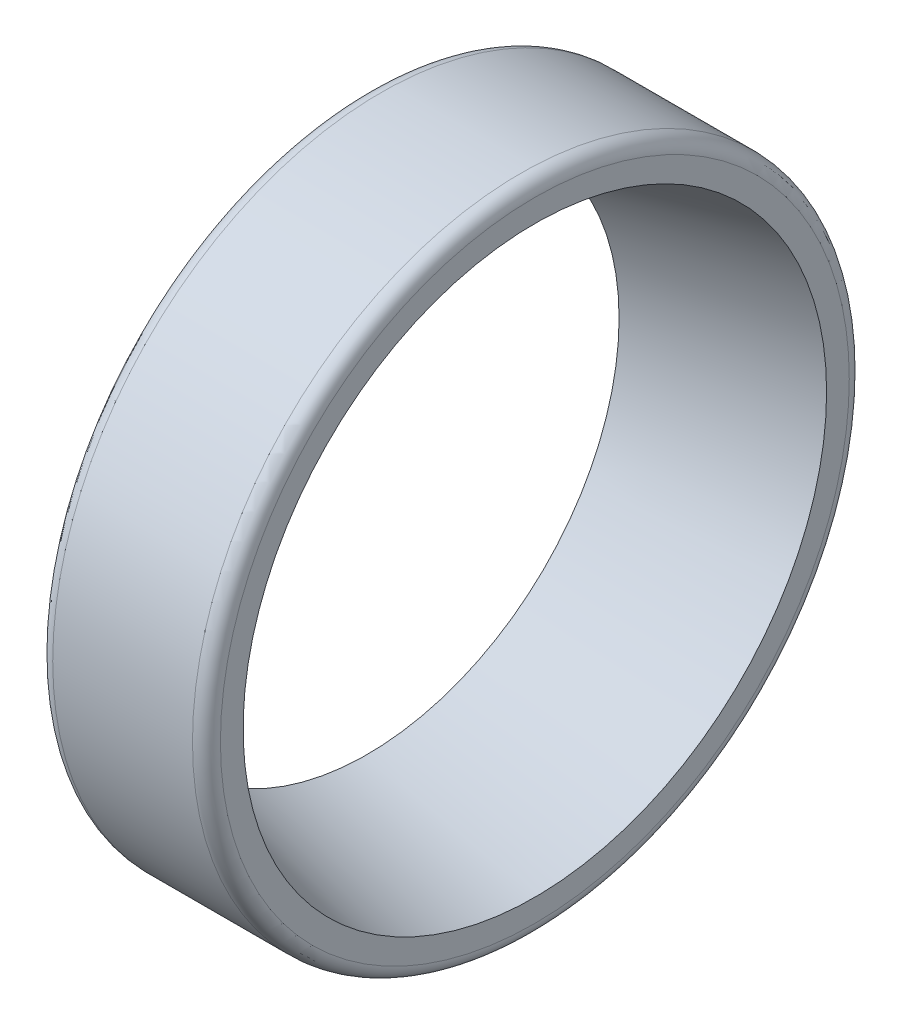
ISO-10303-21;
HEADER;
FILE_DESCRIPTION(('STEP AP214'),'2;1');
FILE_NAME('part.step','',(''),(''),'','','');
FILE_SCHEMA(('AUTOMOTIVE_DESIGN { 1 0 10303 214 1 1 1 1 }'));
ENDSEC;
DATA;
#1=APPLICATION_CONTEXT('core data for automotive mechanical design processes');
#2=APPLICATION_PROTOCOL_DEFINITION('international standard','automotive_design',2000,#1);
#3=PRODUCT_CONTEXT('',#1,'mechanical');
#4=PRODUCT('Part','Part','',(#3));
#5=PRODUCT_RELATED_PRODUCT_CATEGORY('part','',(#4));
#6=PRODUCT_DEFINITION_FORMATION('','',#4);
#7=PRODUCT_DEFINITION_CONTEXT('part definition',#1,'design');
#8=PRODUCT_DEFINITION('design','',#6,#7);
#9=PRODUCT_DEFINITION_SHAPE('','',#8);
#10=(LENGTH_UNIT() NAMED_UNIT(*) SI_UNIT(.MILLI.,.METRE.));
#11=(NAMED_UNIT(*) PLANE_ANGLE_UNIT() SI_UNIT($,.RADIAN.));
#12=(NAMED_UNIT(*) SI_UNIT($,.STERADIAN.) SOLID_ANGLE_UNIT());
#13=UNCERTAINTY_MEASURE_WITH_UNIT(LENGTH_MEASURE(1.E-05),#10,'distance_accuracy_value','');
#14=(GEOMETRIC_REPRESENTATION_CONTEXT(3) GLOBAL_UNCERTAINTY_ASSIGNED_CONTEXT((#13)) GLOBAL_UNIT_ASSIGNED_CONTEXT((#10,
#11,#12)) REPRESENTATION_CONTEXT('',''));
#15=CARTESIAN_POINT('',(0.,0.,0.));
#16=DIRECTION('',(0.,0.,1.));
#17=DIRECTION('',(1.,0.,0.));
#18=AXIS2_PLACEMENT_3D('',#15,#16,#17);
#19=CARTESIAN_POINT('',(0.99999999999922,0.,0.));
#20=DIRECTION('',(1.,0.,0.));
#21=DIRECTION('',(0.,0.,-1.));
#22=AXIS2_PLACEMENT_3D('',#19,#20,#21);
#23=TOROIDAL_SURFACE('',#22,22.5000000000008,0.999999999999219);
#24=CARTESIAN_POINT('',(0.,0.,0.));
#25=DIRECTION('',(1.,0.,0.));
#26=DIRECTION('',(0.,0.,-1.));
#27=AXIS2_PLACEMENT_3D('',#24,#25,#26);
#28=CIRCLE('',#27,22.5000000000008);
#29=CARTESIAN_POINT('',(0.,0.,-22.5000000000008));
#30=VERTEX_POINT('',#29);
#31=EDGE_CURVE('E10',#30,#30,#28,.T.);
#32=ORIENTED_EDGE('',*,*,#31,.T.);
#33=EDGE_LOOP('',(#32));
#34=FACE_BOUND('',#33,.T.);
#35=CARTESIAN_POINT('',(0.999999999999214,0.,0.));
#36=DIRECTION('',(1.,0.,0.));
#37=DIRECTION('',(0.,0.,-1.));
#38=AXIS2_PLACEMENT_3D('',#35,#36,#37);
#39=CIRCLE('',#38,23.5);
#40=CARTESIAN_POINT('',(0.999999999999214,0.,-23.5));
#41=VERTEX_POINT('',#40);
#42=EDGE_CURVE('E55',#41,#41,#39,.T.);
#43=ORIENTED_EDGE('',*,*,#42,.F.);
#44=EDGE_LOOP('',(#43));
#45=FACE_BOUND('',#44,.T.);
#46=ADVANCED_FACE('F33',(#34,#45),#23,.T.);
#47=CARTESIAN_POINT('',(0.,22.5000000000008,0.));
#48=DIRECTION('',(-1.,0.,0.));
#49=DIRECTION('',(0.,0.,1.));
#50=AXIS2_PLACEMENT_3D('',#47,#48,#49);
#51=PLANE('',#50);
#52=CARTESIAN_POINT('',(0.,0.,0.));
#53=DIRECTION('',(1.,0.,0.));
#54=DIRECTION('',(0.,0.,-1.));
#55=AXIS2_PLACEMENT_3D('',#52,#53,#54);
#56=CIRCLE('',#55,18.02838985001);
#57=CARTESIAN_POINT('',(0.,0.,-18.02838985001));
#58=VERTEX_POINT('',#57);
#59=EDGE_CURVE('E39',#58,#58,#56,.T.);
#60=ORIENTED_EDGE('',*,*,#59,.T.);
#61=EDGE_LOOP('',(#60));
#62=FACE_BOUND('',#61,.T.);
#63=ORIENTED_EDGE('',*,*,#31,.F.);
#64=EDGE_LOOP('',(#63));
#65=FACE_BOUND('',#64,.T.);
#66=ADVANCED_FACE('F63',(#62,#65),#51,.T.);
#67=CARTESIAN_POINT('',(0.,0.,0.));
#68=DIRECTION('',(1.,0.,0.));
#69=DIRECTION('',(0.,0.,-1.));
#70=AXIS2_PLACEMENT_3D('',#67,#68,#69);
#71=CONICAL_SURFACE('',#70,18.02838985001,0.233100915374762);
#72=CARTESIAN_POINT('',(12.,0.,0.));
#73=DIRECTION('',(1.,0.,0.));
#74=DIRECTION('',(0.,0.,-1.));
#75=AXIS2_PLACEMENT_3D('',#72,#73,#74);
#76=CIRCLE('',#75,20.87738985001);
#77=CARTESIAN_POINT('',(12.,0.,-20.87738985001));
#78=VERTEX_POINT('',#77);
#79=EDGE_CURVE('E43',#78,#78,#76,.T.);
#80=ORIENTED_EDGE('',*,*,#79,.T.);
#81=EDGE_LOOP('',(#80));
#82=FACE_BOUND('',#81,.T.);
#83=ORIENTED_EDGE('',*,*,#59,.F.);
#84=EDGE_LOOP('',(#83));
#85=FACE_BOUND('',#84,.T.);
#86=ADVANCED_FACE('F67',(#82,#85),#71,.F.);
#87=CARTESIAN_POINT('',(12.,20.87738985001,0.));
#88=DIRECTION('',(1.,0.,0.));
#89=DIRECTION('',(0.,0.,-1.));
#90=AXIS2_PLACEMENT_3D('',#87,#88,#89);
#91=PLANE('',#90);
#92=CARTESIAN_POINT('',(12.,0.,0.));
#93=DIRECTION('',(1.,0.,0.));
#94=DIRECTION('',(0.,0.,-1.));
#95=AXIS2_PLACEMENT_3D('',#92,#93,#94);
#96=CIRCLE('',#95,22.4999999999967);
#97=CARTESIAN_POINT('',(12.,0.,-22.4999999999967));
#98=VERTEX_POINT('',#97);
#99=EDGE_CURVE('E47',#98,#98,#96,.T.);
#100=ORIENTED_EDGE('',*,*,#99,.T.);
#101=EDGE_LOOP('',(#100));
#102=FACE_BOUND('',#101,.T.);
#103=ORIENTED_EDGE('',*,*,#79,.F.);
#104=EDGE_LOOP('',(#103));
#105=FACE_BOUND('',#104,.T.);
#106=ADVANCED_FACE('F71',(#102,#105),#91,.T.);
#107=CARTESIAN_POINT('',(10.9999999999967,0.,0.));
#108=DIRECTION('',(1.,0.,0.));
#109=DIRECTION('',(0.,0.,-1.));
#110=AXIS2_PLACEMENT_3D('',#107,#108,#109);
#111=TOROIDAL_SURFACE('',#110,22.4999999999967,1.0000000000033);
#112=CARTESIAN_POINT('',(10.9999999999967,0.,0.));
#113=DIRECTION('',(1.,0.,0.));
#114=DIRECTION('',(0.,0.,-1.));
#115=AXIS2_PLACEMENT_3D('',#112,#113,#114);
#116=CIRCLE('',#115,23.5);
#117=CARTESIAN_POINT('',(10.9999999999967,0.,-23.5));
#118=VERTEX_POINT('',#117);
#119=EDGE_CURVE('E52',#118,#118,#116,.T.);
#120=ORIENTED_EDGE('',*,*,#119,.T.);
#121=EDGE_LOOP('',(#120));
#122=FACE_BOUND('',#121,.T.);
#123=ORIENTED_EDGE('',*,*,#99,.F.);
#124=EDGE_LOOP('',(#123));
#125=FACE_BOUND('',#124,.T.);
#126=ADVANCED_FACE('F78',(#122,#125),#111,.T.);
#127=CARTESIAN_POINT('',(-0.00126100208619625,0.,0.));
#128=DIRECTION('',(1.,0.,0.));
#129=DIRECTION('',(0.,0.,-1.));
#130=AXIS2_PLACEMENT_3D('',#127,#128,#129);
#131=CYLINDRICAL_SURFACE('',#130,23.5);
#132=ORIENTED_EDGE('',*,*,#42,.T.);
#133=EDGE_LOOP('',(#132));
#134=FACE_BOUND('',#133,.T.);
#135=ORIENTED_EDGE('',*,*,#119,.F.);
#136=EDGE_LOOP('',(#135));
#137=FACE_BOUND('',#136,.T.);
#138=ADVANCED_FACE('F59',(#134,#137),#131,.T.);
#139=CLOSED_SHELL('',(#46,#66,#86,#106,#126,#138));
#140=MANIFOLD_SOLID_BREP('B2',#139);
#141=ADVANCED_BREP_SHAPE_REPRESENTATION('',(#18,#140),#14);
#142=SHAPE_DEFINITION_REPRESENTATION(#9,#141);
ENDSEC;
END-ISO-10303-21;
